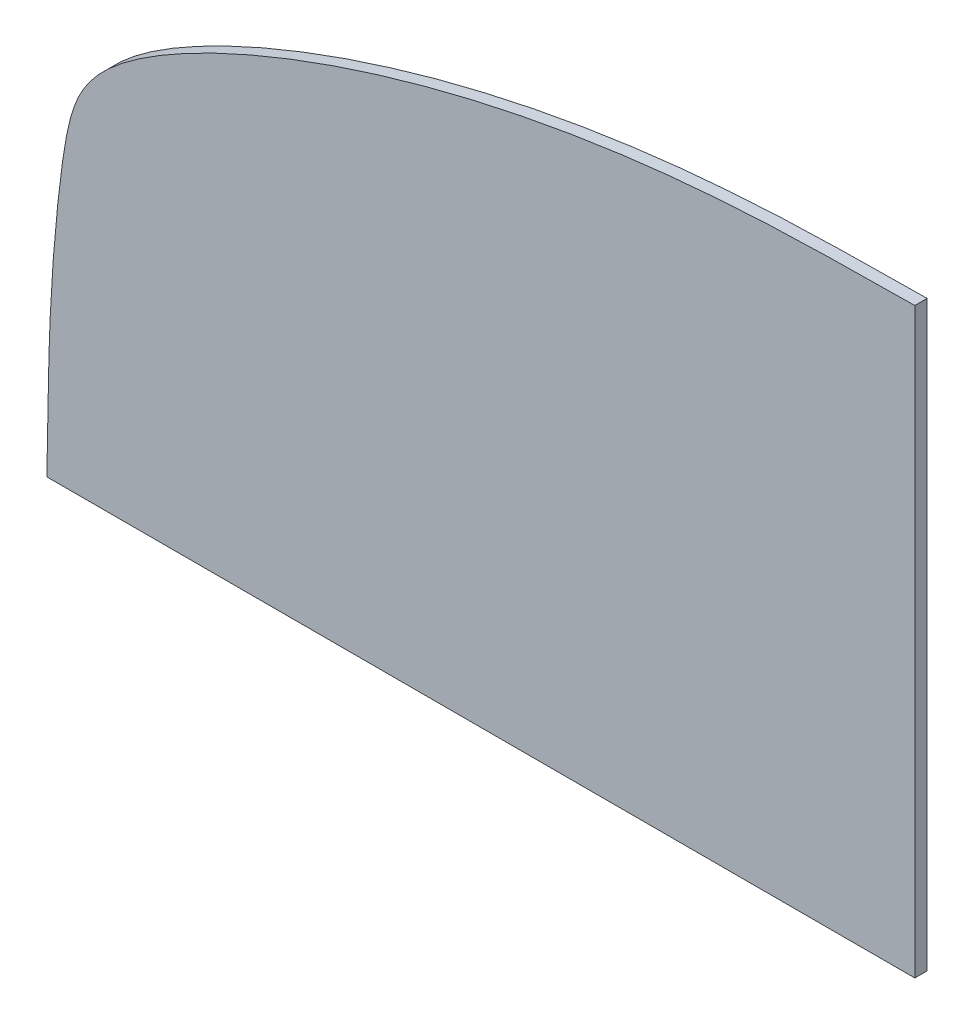
ISO-10303-21;
HEADER;
FILE_DESCRIPTION(('STEP AP214'),'2;1');
FILE_NAME('part.step','',(''),(''),'','','');
FILE_SCHEMA(('AUTOMOTIVE_DESIGN { 1 0 10303 214 1 1 1 1 }'));
ENDSEC;
DATA;
#1=APPLICATION_CONTEXT('core data for automotive mechanical design processes');
#2=APPLICATION_PROTOCOL_DEFINITION('international standard','automotive_design',2000,#1);
#3=PRODUCT_CONTEXT('',#1,'mechanical');
#4=PRODUCT('Part','Part','',(#3));
#5=PRODUCT_RELATED_PRODUCT_CATEGORY('part','',(#4));
#6=PRODUCT_DEFINITION_FORMATION('','',#4);
#7=PRODUCT_DEFINITION_CONTEXT('part definition',#1,'design');
#8=PRODUCT_DEFINITION('design','',#6,#7);
#9=PRODUCT_DEFINITION_SHAPE('','',#8);
#10=(LENGTH_UNIT() NAMED_UNIT(*) SI_UNIT(.MILLI.,.METRE.));
#11=(NAMED_UNIT(*) PLANE_ANGLE_UNIT() SI_UNIT($,.RADIAN.));
#12=(NAMED_UNIT(*) SI_UNIT($,.STERADIAN.) SOLID_ANGLE_UNIT());
#13=UNCERTAINTY_MEASURE_WITH_UNIT(LENGTH_MEASURE(1.E-05),#10,'distance_accuracy_value','');
#14=(GEOMETRIC_REPRESENTATION_CONTEXT(3) GLOBAL_UNCERTAINTY_ASSIGNED_CONTEXT((#13)) GLOBAL_UNIT_ASSIGNED_CONTEXT((#10,
#11,#12)) REPRESENTATION_CONTEXT('',''));
#15=CARTESIAN_POINT('',(0.,0.,0.));
#16=DIRECTION('',(0.,0.,1.));
#17=DIRECTION('',(1.,0.,0.));
#18=AXIS2_PLACEMENT_3D('',#15,#16,#17);
#19=CARTESIAN_POINT('',(-728.929430483745,527.536706610194,12.));
#20=CARTESIAN_POINT('',(-881.692727909294,524.820644104598,12.));
#21=CARTESIAN_POINT('',(-1074.20065966263,533.048190909182,12.));
#22=CARTESIAN_POINT('',(-1220.28060039412,477.58614884303,12.));
#23=CARTESIAN_POINT('',(-1376.02164542432,448.172306309779,12.));
#24=CARTESIAN_POINT('',(-1487.86134981613,389.086678402978,12.));
#25=CARTESIAN_POINT('',(-1593.04396705602,291.637608503515,12.));
#26=CARTESIAN_POINT('',(-1557.45164540168,325.596707935848,12.));
#27=CARTESIAN_POINT('',(-1519.22835952044,283.429382556878,12.));
#28=CARTESIAN_POINT('',(-1585.26416942425,266.920430080925,12.));
#29=CARTESIAN_POINT('',(-1569.09844355256,86.8249291903216,12.));
#30=CARTESIAN_POINT('',(-1573.92943048374,-39.4632933898058,12.));
#31=B_SPLINE_CURVE_WITH_KNOTS('',11,(#19,#20,#21,#22,#23,#24,#25,#26,#27,#28,#29,#30),
.UNSPECIFIED.,.F.,.F.,(12,12),(0.,1.),.UNSPECIFIED.);
#32=DIRECTION('',(0.,0.,-1.));
#33=VECTOR('',#32,1.);
#34=SURFACE_OF_LINEAR_EXTRUSION('',#31,#33);
#35=CARTESIAN_POINT('',(-728.929430483745,527.536706610194,0.));
#36=CARTESIAN_POINT('',(-881.692727909294,524.820644104598,0.));
#37=CARTESIAN_POINT('',(-1074.20065966263,533.048190909182,0.));
#38=CARTESIAN_POINT('',(-1220.28060039412,477.58614884303,0.));
#39=CARTESIAN_POINT('',(-1376.02164542432,448.172306309779,0.));
#40=CARTESIAN_POINT('',(-1487.86134981613,389.086678402978,0.));
#41=CARTESIAN_POINT('',(-1593.04396705602,291.637608503515,0.));
#42=CARTESIAN_POINT('',(-1557.45164540168,325.596707935848,0.));
#43=CARTESIAN_POINT('',(-1519.22835952044,283.429382556878,0.));
#44=CARTESIAN_POINT('',(-1585.26416942425,266.920430080925,0.));
#45=CARTESIAN_POINT('',(-1569.09844355256,86.8249291903216,0.));
#46=CARTESIAN_POINT('',(-1573.92943048374,-39.4632933898058,0.));
#47=B_SPLINE_CURVE_WITH_KNOTS('',11,(#35,#36,#37,#38,#39,#40,#41,#42,#43,#44,#45,#46),
.UNSPECIFIED.,.F.,.F.,(12,12),(0.,1.),.UNSPECIFIED.);
#48=CARTESIAN_POINT('',(-728.929430483745,527.536706610194,0.));
#49=VERTEX_POINT('',#48);
#50=CARTESIAN_POINT('',(-1573.92943048374,-39.4632933898058,0.));
#51=VERTEX_POINT('',#50);
#52=EDGE_CURVE('E79',#49,#51,#47,.T.);
#53=ORIENTED_EDGE('',*,*,#52,.T.);
#54=DIRECTION('',(0.,0.,-1.));
#55=VECTOR('',#54,1.);
#56=CARTESIAN_POINT('',(-1573.92943048374,-39.4632933898058,12.));
#57=LINE('',#56,#55);
#58=CARTESIAN_POINT('',(-1573.92943048374,-39.4632933898058,12.));
#59=VERTEX_POINT('',#58);
#60=EDGE_CURVE('E11',#59,#51,#57,.T.);
#61=ORIENTED_EDGE('',*,*,#60,.F.);
#62=CARTESIAN_POINT('',(-728.929430483745,527.536706610194,12.));
#63=VERTEX_POINT('',#62);
#64=EDGE_CURVE('E73',#63,#59,#31,.T.);
#65=ORIENTED_EDGE('',*,*,#64,.F.);
#66=DIRECTION('',(0.,0.,-1.));
#67=VECTOR('',#66,1.);
#68=CARTESIAN_POINT('',(-728.929430483745,527.536706610194,12.));
#69=LINE('',#68,#67);
#70=EDGE_CURVE('E80',#63,#49,#69,.T.);
#71=ORIENTED_EDGE('',*,*,#70,.T.);
#72=EDGE_LOOP('',(#53,#61,#65,#71));
#73=FACE_BOUND('',#72,.T.);
#74=ADVANCED_FACE('F32',(#73),#34,.F.);
#75=CARTESIAN_POINT('',(-1573.92943048374,-39.4632933898058,12.));
#76=DIRECTION('',(0.,1.,0.));
#77=DIRECTION('',(0.,0.,1.));
#78=AXIS2_PLACEMENT_3D('',#75,#76,#77);
#79=PLANE('',#78);
#80=DIRECTION('',(1.,0.,0.));
#81=VECTOR('',#80,1.);
#82=CARTESIAN_POINT('',(-1573.92943048374,-39.4632933898058,0.));
#83=LINE('',#82,#81);
#84=CARTESIAN_POINT('',(-728.929430483745,-39.4632933898058,0.));
#85=VERTEX_POINT('',#84);
#86=EDGE_CURVE('E61',#51,#85,#83,.T.);
#87=ORIENTED_EDGE('',*,*,#86,.T.);
#88=DIRECTION('',(0.,0.,-1.));
#89=VECTOR('',#88,1.);
#90=CARTESIAN_POINT('',(-728.929430483745,-39.4632933898058,12.));
#91=LINE('',#90,#89);
#92=CARTESIAN_POINT('',(-728.929430483745,-39.4632933898058,12.));
#93=VERTEX_POINT('',#92);
#94=EDGE_CURVE('E41',#93,#85,#91,.T.);
#95=ORIENTED_EDGE('',*,*,#94,.F.);
#96=DIRECTION('',(1.,0.,0.));
#97=VECTOR('',#96,1.);
#98=CARTESIAN_POINT('',(-1573.92943048374,-39.4632933898058,12.));
#99=LINE('',#98,#97);
#100=EDGE_CURVE('E69',#59,#93,#99,.T.);
#101=ORIENTED_EDGE('',*,*,#100,.F.);
#102=ORIENTED_EDGE('',*,*,#60,.T.);
#103=EDGE_LOOP('',(#87,#95,#101,#102));
#104=FACE_BOUND('',#103,.T.);
#105=ADVANCED_FACE('F70',(#104),#79,.F.);
#106=CARTESIAN_POINT('',(-728.929430483745,-39.4632933898058,12.));
#107=DIRECTION('',(-1.,0.,0.));
#108=DIRECTION('',(0.,0.,1.));
#109=AXIS2_PLACEMENT_3D('',#106,#107,#108);
#110=PLANE('',#109);
#111=DIRECTION('',(0.,1.,0.));
#112=VECTOR('',#111,1.);
#113=CARTESIAN_POINT('',(-728.929430483745,-39.4632933898058,0.));
#114=LINE('',#113,#112);
#115=EDGE_CURVE('E66',#85,#49,#114,.T.);
#116=ORIENTED_EDGE('',*,*,#115,.T.);
#117=ORIENTED_EDGE('',*,*,#70,.F.);
#118=DIRECTION('',(0.,1.,0.));
#119=VECTOR('',#118,1.);
#120=CARTESIAN_POINT('',(-728.929430483745,-39.4632933898058,12.));
#121=LINE('',#120,#119);
#122=EDGE_CURVE('E49',#93,#63,#121,.T.);
#123=ORIENTED_EDGE('',*,*,#122,.F.);
#124=ORIENTED_EDGE('',*,*,#94,.T.);
#125=EDGE_LOOP('',(#116,#117,#123,#124));
#126=FACE_BOUND('',#125,.T.);
#127=ADVANCED_FACE('F92',(#126),#110,.F.);
#128=CARTESIAN_POINT('',(-1474.10915434582,364.560745511114,12.));
#129=DIRECTION('',(0.,0.,-1.));
#130=DIRECTION('',(-1.,0.,0.));
#131=AXIS2_PLACEMENT_3D('',#128,#129,#130);
#132=PLANE('',#131);
#133=ORIENTED_EDGE('',*,*,#64,.T.);
#134=ORIENTED_EDGE('',*,*,#100,.T.);
#135=ORIENTED_EDGE('',*,*,#122,.T.);
#136=EDGE_LOOP('',(#133,#134,#135));
#137=FACE_BOUND('',#136,.T.);
#138=ADVANCED_FACE('F76',(#137),#132,.F.);
#139=CARTESIAN_POINT('',(-1474.10915434582,364.560745511114,0.));
#140=DIRECTION('',(0.,0.,-1.));
#141=DIRECTION('',(-1.,0.,0.));
#142=AXIS2_PLACEMENT_3D('',#139,#140,#141);
#143=PLANE('',#142);
#144=ORIENTED_EDGE('',*,*,#52,.F.);
#145=ORIENTED_EDGE('',*,*,#115,.F.);
#146=ORIENTED_EDGE('',*,*,#86,.F.);
#147=EDGE_LOOP('',(#144,#145,#146));
#148=FACE_BOUND('',#147,.T.);
#149=ADVANCED_FACE('F93',(#148),#143,.T.);
#150=CLOSED_SHELL('',(#74,#105,#127,#138,#149));
#151=MANIFOLD_SOLID_BREP('B2',#150);
#152=ADVANCED_BREP_SHAPE_REPRESENTATION('',(#18,#151),#14);
#153=SHAPE_DEFINITION_REPRESENTATION(#9,#152);
ENDSEC;
END-ISO-10303-21;
